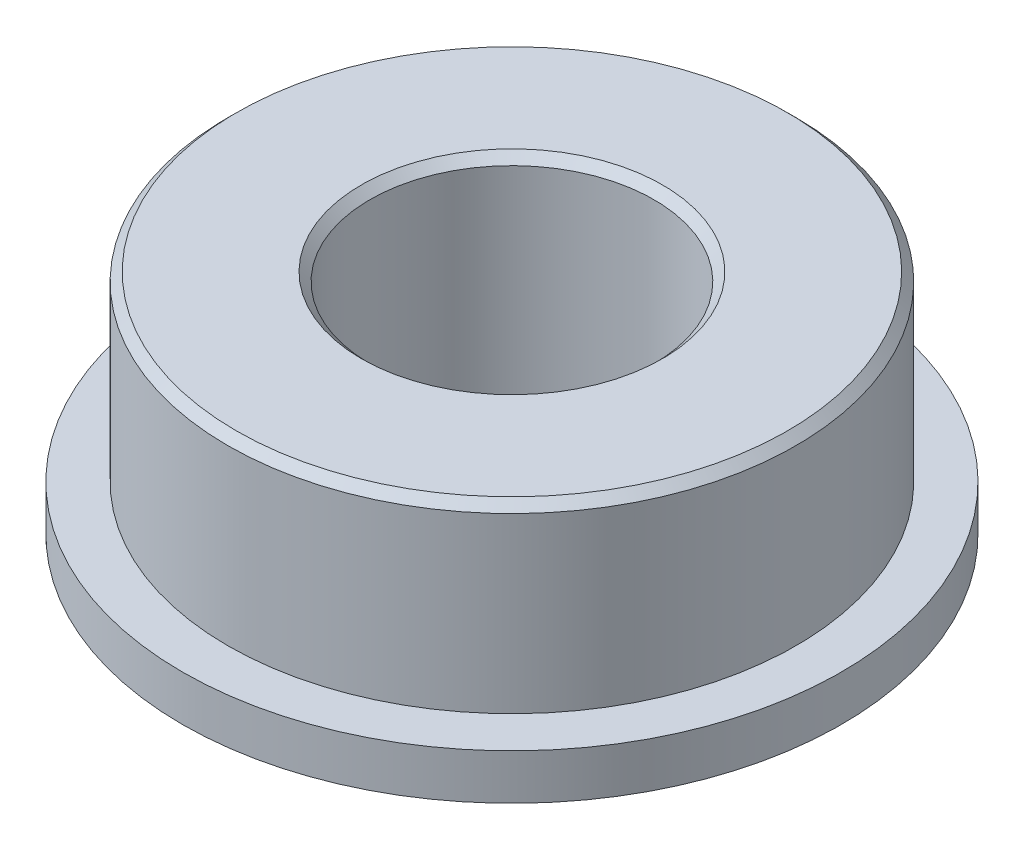
ISO-10303-21;
HEADER;
FILE_DESCRIPTION(('STEP AP214'),'2;1');
FILE_NAME('part.step','',(''),(''),'','','');
FILE_SCHEMA(('AUTOMOTIVE_DESIGN { 1 0 10303 214 1 1 1 1 }'));
ENDSEC;
DATA;
#1=APPLICATION_CONTEXT('core data for automotive mechanical design processes');
#2=APPLICATION_PROTOCOL_DEFINITION('international standard','automotive_design',2000,#1);
#3=PRODUCT_CONTEXT('',#1,'mechanical');
#4=PRODUCT('Part','Part','',(#3));
#5=PRODUCT_RELATED_PRODUCT_CATEGORY('part','',(#4));
#6=PRODUCT_DEFINITION_FORMATION('','',#4);
#7=PRODUCT_DEFINITION_CONTEXT('part definition',#1,'design');
#8=PRODUCT_DEFINITION('design','',#6,#7);
#9=PRODUCT_DEFINITION_SHAPE('','',#8);
#10=(LENGTH_UNIT() NAMED_UNIT(*) SI_UNIT(.MILLI.,.METRE.));
#11=(NAMED_UNIT(*) PLANE_ANGLE_UNIT() SI_UNIT($,.RADIAN.));
#12=(NAMED_UNIT(*) SI_UNIT($,.STERADIAN.) SOLID_ANGLE_UNIT());
#13=UNCERTAINTY_MEASURE_WITH_UNIT(LENGTH_MEASURE(1.E-05),#10,'distance_accuracy_value','');
#14=(GEOMETRIC_REPRESENTATION_CONTEXT(3) GLOBAL_UNCERTAINTY_ASSIGNED_CONTEXT((#13)) GLOBAL_UNIT_ASSIGNED_CONTEXT((#10,
#11,#12)) REPRESENTATION_CONTEXT('',''));
#15=CARTESIAN_POINT('',(0.,0.,0.));
#16=DIRECTION('',(0.,0.,1.));
#17=DIRECTION('',(1.,0.,0.));
#18=AXIS2_PLACEMENT_3D('',#15,#16,#17);
#19=CARTESIAN_POINT('',(0.,0.8,0.));
#20=DIRECTION('',(0.,-1.,0.));
#21=DIRECTION('',(0.,0.,-1.));
#22=AXIS2_PLACEMENT_3D('',#19,#20,#21);
#23=CYLINDRICAL_SURFACE('',#22,5.8);
#24=CARTESIAN_POINT('',(0.,0.8,0.));
#25=DIRECTION('',(0.,1.,0.));
#26=DIRECTION('',(0.,0.,1.));
#27=AXIS2_PLACEMENT_3D('',#24,#25,#26);
#28=CIRCLE('',#27,5.8);
#29=CARTESIAN_POINT('',(0.,0.8,5.8));
#30=VERTEX_POINT('',#29);
#31=EDGE_CURVE('E57',#30,#30,#28,.T.);
#32=ORIENTED_EDGE('',*,*,#31,.F.);
#33=EDGE_LOOP('',(#32));
#34=FACE_BOUND('',#33,.T.);
#35=CARTESIAN_POINT('',(0.,0.,0.));
#36=DIRECTION('',(0.,1.,0.));
#37=DIRECTION('',(0.,0.,1.));
#38=AXIS2_PLACEMENT_3D('',#35,#36,#37);
#39=CIRCLE('',#38,5.8);
#40=CARTESIAN_POINT('',(0.,0.,5.8));
#41=VERTEX_POINT('',#40);
#42=EDGE_CURVE('E58',#41,#41,#39,.T.);
#43=ORIENTED_EDGE('',*,*,#42,.T.);
#44=EDGE_LOOP('',(#43));
#45=FACE_BOUND('',#44,.T.);
#46=ADVANCED_FACE('F31',(#34,#45),#23,.T.);
#47=CARTESIAN_POINT('',(0.,0.8,0.));
#48=DIRECTION('',(0.,1.,0.));
#49=DIRECTION('',(0.,0.,1.));
#50=AXIS2_PLACEMENT_3D('',#47,#48,#49);
#51=PLANE('',#50);
#52=CARTESIAN_POINT('',(0.,0.8,0.));
#53=DIRECTION('',(0.,1.,0.));
#54=DIRECTION('',(0.,0.,1.));
#55=AXIS2_PLACEMENT_3D('',#52,#53,#54);
#56=CIRCLE('',#55,5.);
#57=CARTESIAN_POINT('',(0.,0.8,5.));
#58=VERTEX_POINT('',#57);
#59=EDGE_CURVE('E61',#58,#58,#56,.T.);
#60=ORIENTED_EDGE('',*,*,#59,.F.);
#61=EDGE_LOOP('',(#60));
#62=FACE_BOUND('',#61,.T.);
#63=ORIENTED_EDGE('',*,*,#31,.T.);
#64=EDGE_LOOP('',(#63));
#65=FACE_BOUND('',#64,.T.);
#66=ADVANCED_FACE('F69',(#62,#65),#51,.T.);
#67=CARTESIAN_POINT('',(0.,0.,0.));
#68=DIRECTION('',(0.,1.,0.));
#69=DIRECTION('',(0.,0.,1.));
#70=AXIS2_PLACEMENT_3D('',#67,#68,#69);
#71=PLANE('',#70);
#72=CARTESIAN_POINT('',(0.,0.,0.));
#73=DIRECTION('',(0.,1.,0.));
#74=DIRECTION('',(0.,0.,1.));
#75=AXIS2_PLACEMENT_3D('',#72,#73,#74);
#76=CIRCLE('',#75,2.65);
#77=CARTESIAN_POINT('',(0.,0.,2.65));
#78=VERTEX_POINT('',#77);
#79=EDGE_CURVE('E54',#78,#78,#76,.T.);
#80=ORIENTED_EDGE('',*,*,#79,.T.);
#81=EDGE_LOOP('',(#80));
#82=FACE_BOUND('',#81,.T.);
#83=ORIENTED_EDGE('',*,*,#42,.F.);
#84=EDGE_LOOP('',(#83));
#85=FACE_BOUND('',#84,.T.);
#86=ADVANCED_FACE('F72',(#82,#85),#71,.F.);
#87=CARTESIAN_POINT('',(0.,4.,0.));
#88=DIRECTION('',(0.,-1.,0.));
#89=DIRECTION('',(0.,0.,-1.));
#90=AXIS2_PLACEMENT_3D('',#87,#88,#89);
#91=CYLINDRICAL_SURFACE('',#90,2.5);
#92=CARTESIAN_POINT('',(0.,0.150000000000001,0.));
#93=DIRECTION('',(0.,1.,0.));
#94=DIRECTION('',(0.,0.,1.));
#95=AXIS2_PLACEMENT_3D('',#92,#93,#94);
#96=CIRCLE('',#95,2.5);
#97=CARTESIAN_POINT('',(0.,0.150000000000001,2.5));
#98=VERTEX_POINT('',#97);
#99=EDGE_CURVE('E46',#98,#98,#96,.F.);
#100=ORIENTED_EDGE('',*,*,#99,.T.);
#101=EDGE_LOOP('',(#100));
#102=FACE_BOUND('',#101,.T.);
#103=CARTESIAN_POINT('',(0.,3.85,0.));
#104=DIRECTION('',(0.,1.,0.));
#105=DIRECTION('',(0.,0.,1.));
#106=AXIS2_PLACEMENT_3D('',#103,#104,#105);
#107=CIRCLE('',#106,2.5);
#108=CARTESIAN_POINT('',(0.,3.85,2.5));
#109=VERTEX_POINT('',#108);
#110=EDGE_CURVE('E51',#109,#109,#107,.T.);
#111=ORIENTED_EDGE('',*,*,#110,.T.);
#112=EDGE_LOOP('',(#111));
#113=FACE_BOUND('',#112,.T.);
#114=ADVANCED_FACE('F82',(#102,#113),#91,.F.);
#115=CARTESIAN_POINT('',(0.,4.,0.));
#116=DIRECTION('',(0.,-1.,0.));
#117=DIRECTION('',(0.,0.,-1.));
#118=AXIS2_PLACEMENT_3D('',#115,#116,#117);
#119=CYLINDRICAL_SURFACE('',#118,5.);
#120=CARTESIAN_POINT('',(0.,3.85,0.));
#121=DIRECTION('',(0.,1.,0.));
#122=DIRECTION('',(0.,0.,1.));
#123=AXIS2_PLACEMENT_3D('',#120,#121,#122);
#124=CIRCLE('',#123,5.);
#125=CARTESIAN_POINT('',(0.,3.85,5.));
#126=VERTEX_POINT('',#125);
#127=EDGE_CURVE('E10',#126,#126,#124,.F.);
#128=ORIENTED_EDGE('',*,*,#127,.T.);
#129=EDGE_LOOP('',(#128));
#130=FACE_BOUND('',#129,.T.);
#131=ORIENTED_EDGE('',*,*,#59,.T.);
#132=EDGE_LOOP('',(#131));
#133=FACE_BOUND('',#132,.T.);
#134=ADVANCED_FACE('F67',(#130,#133),#119,.T.);
#135=CARTESIAN_POINT('',(0.,4.,0.));
#136=DIRECTION('',(0.,1.,0.));
#137=DIRECTION('',(0.,0.,1.));
#138=AXIS2_PLACEMENT_3D('',#135,#136,#137);
#139=PLANE('',#138);
#140=CARTESIAN_POINT('',(0.,4.,0.));
#141=DIRECTION('',(0.,1.,0.));
#142=DIRECTION('',(0.,0.,1.));
#143=AXIS2_PLACEMENT_3D('',#140,#141,#142);
#144=CIRCLE('',#143,2.65);
#145=CARTESIAN_POINT('',(0.,4.,2.65));
#146=VERTEX_POINT('',#145);
#147=EDGE_CURVE('E38',#146,#146,#144,.F.);
#148=ORIENTED_EDGE('',*,*,#147,.T.);
#149=EDGE_LOOP('',(#148));
#150=FACE_BOUND('',#149,.T.);
#151=CARTESIAN_POINT('',(0.,4.,0.));
#152=DIRECTION('',(0.,1.,0.));
#153=DIRECTION('',(0.,0.,1.));
#154=AXIS2_PLACEMENT_3D('',#151,#152,#153);
#155=CIRCLE('',#154,4.85);
#156=CARTESIAN_POINT('',(0.,4.,4.85));
#157=VERTEX_POINT('',#156);
#158=EDGE_CURVE('E42',#157,#157,#155,.T.);
#159=ORIENTED_EDGE('',*,*,#158,.T.);
#160=EDGE_LOOP('',(#159));
#161=FACE_BOUND('',#160,.T.);
#162=ADVANCED_FACE('F94',(#150,#161),#139,.T.);
#163=CARTESIAN_POINT('',(0.,0.,0.));
#164=DIRECTION('',(0.,-1.,0.));
#165=DIRECTION('',(0.,0.,-1.));
#166=AXIS2_PLACEMENT_3D('',#163,#164,#165);
#167=CONICAL_SURFACE('',#166,2.65,0.78539816339745);
#168=ORIENTED_EDGE('',*,*,#99,.F.);
#169=EDGE_LOOP('',(#168));
#170=FACE_BOUND('',#169,.T.);
#171=ORIENTED_EDGE('',*,*,#79,.F.);
#172=EDGE_LOOP('',(#171));
#173=FACE_BOUND('',#172,.T.);
#174=ADVANCED_FACE('F91',(#170,#173),#167,.F.);
#175=CARTESIAN_POINT('',(0.,3.85,0.));
#176=DIRECTION('',(0.,1.,0.));
#177=DIRECTION('',(0.,0.,1.));
#178=AXIS2_PLACEMENT_3D('',#175,#176,#177);
#179=CONICAL_SURFACE('',#178,2.5,0.785398163397448);
#180=ORIENTED_EDGE('',*,*,#147,.F.);
#181=EDGE_LOOP('',(#180));
#182=FACE_BOUND('',#181,.T.);
#183=ORIENTED_EDGE('',*,*,#110,.F.);
#184=EDGE_LOOP('',(#183));
#185=FACE_BOUND('',#184,.T.);
#186=ADVANCED_FACE('F93',(#182,#185),#179,.F.);
#187=CARTESIAN_POINT('',(0.,4.,0.));
#188=DIRECTION('',(0.,-1.,0.));
#189=DIRECTION('',(0.,0.,-1.));
#190=AXIS2_PLACEMENT_3D('',#187,#188,#189);
#191=CONICAL_SURFACE('',#190,4.85,0.785398163397448);
#192=ORIENTED_EDGE('',*,*,#127,.F.);
#193=EDGE_LOOP('',(#192));
#194=FACE_BOUND('',#193,.T.);
#195=ORIENTED_EDGE('',*,*,#158,.F.);
#196=EDGE_LOOP('',(#195));
#197=FACE_BOUND('',#196,.T.);
#198=ADVANCED_FACE('F33',(#194,#197),#191,.T.);
#199=CLOSED_SHELL('',(#46,#66,#86,#114,#134,#162,#174,#186,#198));
#200=MANIFOLD_SOLID_BREP('B2',#199);
#201=ADVANCED_BREP_SHAPE_REPRESENTATION('',(#18,#200),#14);
#202=SHAPE_DEFINITION_REPRESENTATION(#9,#201);
ENDSEC;
END-ISO-10303-21;
